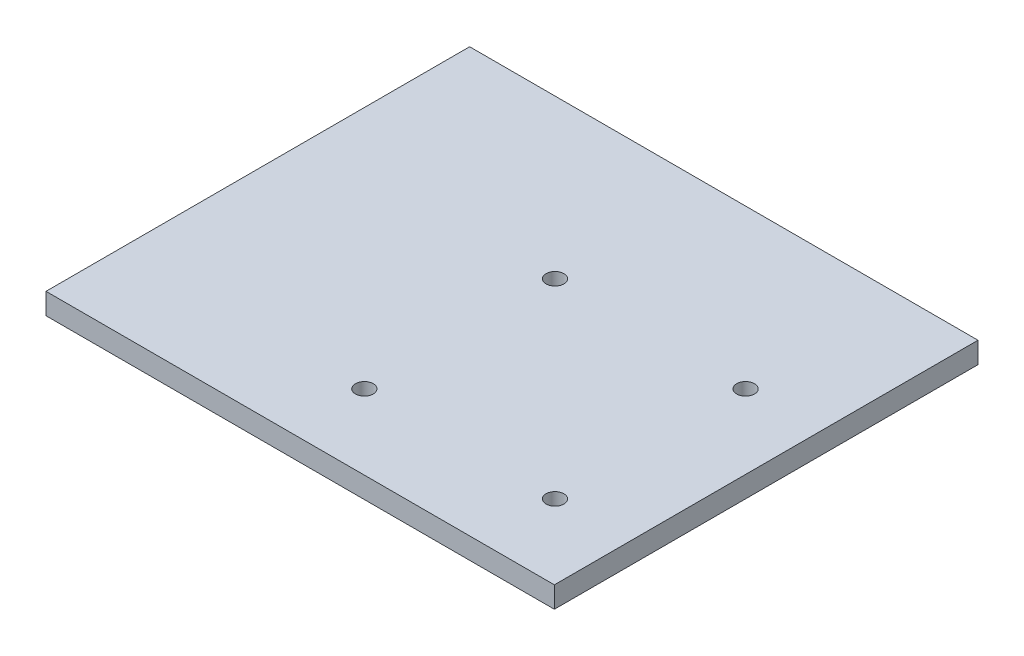
ISO-10303-21;
HEADER;
FILE_DESCRIPTION(('STEP AP214'),'2;1');
FILE_NAME('part.step','',(''),(''),'','','');
FILE_SCHEMA(('AUTOMOTIVE_DESIGN { 1 0 10303 214 1 1 1 1 }'));
ENDSEC;
DATA;
#1=APPLICATION_CONTEXT('core data for automotive mechanical design processes');
#2=APPLICATION_PROTOCOL_DEFINITION('international standard','automotive_design',2000,#1);
#3=PRODUCT_CONTEXT('',#1,'mechanical');
#4=PRODUCT('Part','Part','',(#3));
#5=PRODUCT_RELATED_PRODUCT_CATEGORY('part','',(#4));
#6=PRODUCT_DEFINITION_FORMATION('','',#4);
#7=PRODUCT_DEFINITION_CONTEXT('part definition',#1,'design');
#8=PRODUCT_DEFINITION('design','',#6,#7);
#9=PRODUCT_DEFINITION_SHAPE('','',#8);
#10=(LENGTH_UNIT() NAMED_UNIT(*) SI_UNIT(.MILLI.,.METRE.));
#11=(NAMED_UNIT(*) PLANE_ANGLE_UNIT() SI_UNIT($,.RADIAN.));
#12=(NAMED_UNIT(*) SI_UNIT($,.STERADIAN.) SOLID_ANGLE_UNIT());
#13=UNCERTAINTY_MEASURE_WITH_UNIT(LENGTH_MEASURE(1.E-05),#10,'distance_accuracy_value','');
#14=(GEOMETRIC_REPRESENTATION_CONTEXT(3) GLOBAL_UNCERTAINTY_ASSIGNED_CONTEXT((#13)) GLOBAL_UNIT_ASSIGNED_CONTEXT((#10,
#11,#12)) REPRESENTATION_CONTEXT('',''));
#15=CARTESIAN_POINT('',(0.,0.,0.));
#16=DIRECTION('',(0.,0.,1.));
#17=DIRECTION('',(1.,0.,0.));
#18=AXIS2_PLACEMENT_3D('',#15,#16,#17);
#19=CARTESIAN_POINT('',(-152.4,12.7,-127.));
#20=DIRECTION('',(1.,0.,0.));
#21=DIRECTION('',(0.,0.,-1.));
#22=AXIS2_PLACEMENT_3D('',#19,#20,#21);
#23=PLANE('',#22);
#24=DIRECTION('',(0.,0.,1.));
#25=VECTOR('',#24,1.);
#26=CARTESIAN_POINT('',(-152.4,0.,-127.));
#27=LINE('',#26,#25);
#28=CARTESIAN_POINT('',(-152.4,0.,-127.));
#29=VERTEX_POINT('',#28);
#30=CARTESIAN_POINT('',(-152.4,0.,127.));
#31=VERTEX_POINT('',#30);
#32=EDGE_CURVE('E98',#29,#31,#27,.T.);
#33=ORIENTED_EDGE('',*,*,#32,.T.);
#34=DIRECTION('',(0.,-1.,0.));
#35=VECTOR('',#34,1.);
#36=CARTESIAN_POINT('',(-152.4,12.7,127.));
#37=LINE('',#36,#35);
#38=CARTESIAN_POINT('',(-152.4,12.7,127.));
#39=VERTEX_POINT('',#38);
#40=EDGE_CURVE('E11',#39,#31,#37,.T.);
#41=ORIENTED_EDGE('',*,*,#40,.F.);
#42=DIRECTION('',(0.,0.,1.));
#43=VECTOR('',#42,1.);
#44=CARTESIAN_POINT('',(-152.4,12.7,-127.));
#45=LINE('',#44,#43);
#46=CARTESIAN_POINT('',(-152.4,12.7,-127.));
#47=VERTEX_POINT('',#46);
#48=EDGE_CURVE('E86',#47,#39,#45,.T.);
#49=ORIENTED_EDGE('',*,*,#48,.F.);
#50=DIRECTION('',(0.,-1.,0.));
#51=VECTOR('',#50,1.);
#52=CARTESIAN_POINT('',(-152.4,12.7,-127.));
#53=LINE('',#52,#51);
#54=EDGE_CURVE('E94',#47,#29,#53,.T.);
#55=ORIENTED_EDGE('',*,*,#54,.T.);
#56=EDGE_LOOP('',(#33,#41,#49,#55));
#57=FACE_BOUND('',#56,.T.);
#58=ADVANCED_FACE('F35',(#57),#23,.F.);
#59=CARTESIAN_POINT('',(-152.4,12.7,127.));
#60=DIRECTION('',(0.,0.,-1.));
#61=DIRECTION('',(-1.,0.,0.));
#62=AXIS2_PLACEMENT_3D('',#59,#60,#61);
#63=PLANE('',#62);
#64=DIRECTION('',(1.,0.,0.));
#65=VECTOR('',#64,1.);
#66=CARTESIAN_POINT('',(-152.4,0.,127.));
#67=LINE('',#66,#65);
#68=CARTESIAN_POINT('',(152.4,0.,127.));
#69=VERTEX_POINT('',#68);
#70=EDGE_CURVE('E90',#31,#69,#67,.T.);
#71=ORIENTED_EDGE('',*,*,#70,.T.);
#72=DIRECTION('',(0.,-1.,0.));
#73=VECTOR('',#72,1.);
#74=CARTESIAN_POINT('',(152.4,12.7,127.));
#75=LINE('',#74,#73);
#76=CARTESIAN_POINT('',(152.4,12.7,127.));
#77=VERTEX_POINT('',#76);
#78=EDGE_CURVE('E43',#77,#69,#75,.T.);
#79=ORIENTED_EDGE('',*,*,#78,.F.);
#80=DIRECTION('',(1.,0.,0.));
#81=VECTOR('',#80,1.);
#82=CARTESIAN_POINT('',(-152.4,12.7,127.));
#83=LINE('',#82,#81);
#84=EDGE_CURVE('E81',#39,#77,#83,.T.);
#85=ORIENTED_EDGE('',*,*,#84,.F.);
#86=ORIENTED_EDGE('',*,*,#40,.T.);
#87=EDGE_LOOP('',(#71,#79,#85,#86));
#88=FACE_BOUND('',#87,.T.);
#89=ADVANCED_FACE('F89',(#88),#63,.F.);
#90=CARTESIAN_POINT('',(152.4,12.7,-127.));
#91=DIRECTION('',(-1.,0.,0.));
#92=DIRECTION('',(0.,0.,1.));
#93=AXIS2_PLACEMENT_3D('',#90,#91,#92);
#94=PLANE('',#93);
#95=DIRECTION('',(0.,0.,-1.));
#96=VECTOR('',#95,1.);
#97=CARTESIAN_POINT('',(152.4,0.,-127.));
#98=LINE('',#97,#96);
#99=CARTESIAN_POINT('',(152.4,0.,-127.));
#100=VERTEX_POINT('',#99);
#101=EDGE_CURVE('E68',#69,#100,#98,.T.);
#102=ORIENTED_EDGE('',*,*,#101,.T.);
#103=DIRECTION('',(0.,-1.,0.));
#104=VECTOR('',#103,1.);
#105=CARTESIAN_POINT('',(152.4,12.7,-127.));
#106=LINE('',#105,#104);
#107=CARTESIAN_POINT('',(152.4,12.7,-127.));
#108=VERTEX_POINT('',#107);
#109=EDGE_CURVE('E91',#108,#100,#106,.T.);
#110=ORIENTED_EDGE('',*,*,#109,.F.);
#111=DIRECTION('',(0.,0.,-1.));
#112=VECTOR('',#111,1.);
#113=CARTESIAN_POINT('',(152.4,12.7,-127.));
#114=LINE('',#113,#112);
#115=EDGE_CURVE('E84',#77,#108,#114,.T.);
#116=ORIENTED_EDGE('',*,*,#115,.F.);
#117=ORIENTED_EDGE('',*,*,#78,.T.);
#118=EDGE_LOOP('',(#102,#110,#116,#117));
#119=FACE_BOUND('',#118,.T.);
#120=ADVANCED_FACE('F92',(#119),#94,.F.);
#121=CARTESIAN_POINT('',(-152.4,12.7,-127.));
#122=DIRECTION('',(0.,0.,1.));
#123=DIRECTION('',(1.,0.,0.));
#124=AXIS2_PLACEMENT_3D('',#121,#122,#123);
#125=PLANE('',#124);
#126=DIRECTION('',(-1.,0.,0.));
#127=VECTOR('',#126,1.);
#128=CARTESIAN_POINT('',(-152.4,0.,-127.));
#129=LINE('',#128,#127);
#130=EDGE_CURVE('E74',#100,#29,#129,.T.);
#131=ORIENTED_EDGE('',*,*,#130,.T.);
#132=ORIENTED_EDGE('',*,*,#54,.F.);
#133=DIRECTION('',(-1.,0.,0.));
#134=VECTOR('',#133,1.);
#135=CARTESIAN_POINT('',(-152.4,12.7,-127.));
#136=LINE('',#135,#134);
#137=EDGE_CURVE('E51',#108,#47,#136,.T.);
#138=ORIENTED_EDGE('',*,*,#137,.F.);
#139=ORIENTED_EDGE('',*,*,#109,.T.);
#140=EDGE_LOOP('',(#131,#132,#138,#139));
#141=FACE_BOUND('',#140,.T.);
#142=ADVANCED_FACE('F106',(#141),#125,.F.);
#143=CARTESIAN_POINT('',(0.,12.7,0.));
#144=DIRECTION('',(0.,1.,0.));
#145=DIRECTION('',(0.,0.,1.));
#146=AXIS2_PLACEMENT_3D('',#143,#144,#145);
#147=PLANE('',#146);
#148=CARTESIAN_POINT('',(-6.32516451792292,12.7,-32.0952428197147));
#149=DIRECTION('',(0.,1.,0.));
#150=DIRECTION('',(0.,0.,1.));
#151=AXIS2_PLACEMENT_3D('',#148,#149,#150);
#152=CIRCLE('',#151,5.35813);
#153=CARTESIAN_POINT('',(-6.32516451792292,12.7,-26.7371128197147));
#154=VERTEX_POINT('',#153);
#155=EDGE_CURVE('E132',#154,#154,#152,.T.);
#156=ORIENTED_EDGE('',*,*,#155,.F.);
#157=EDGE_LOOP('',(#156));
#158=FACE_BOUND('',#157,.T.);
#159=CARTESIAN_POINT('',(107.974835482077,12.7,-32.0952428197147));
#160=DIRECTION('',(0.,1.,0.));
#161=DIRECTION('',(0.,0.,1.));
#162=AXIS2_PLACEMENT_3D('',#159,#160,#161);
#163=CIRCLE('',#162,5.35813);
#164=CARTESIAN_POINT('',(107.974835482077,12.7,-26.7371128197147));
#165=VERTEX_POINT('',#164);
#166=EDGE_CURVE('E126',#165,#165,#163,.T.);
#167=ORIENTED_EDGE('',*,*,#166,.F.);
#168=EDGE_LOOP('',(#167));
#169=FACE_BOUND('',#168,.T.);
#170=CARTESIAN_POINT('',(107.974835482077,12.7,82.2047571802853));
#171=DIRECTION('',(0.,1.,0.));
#172=DIRECTION('',(0.,0.,1.));
#173=AXIS2_PLACEMENT_3D('',#170,#171,#172);
#174=CIRCLE('',#173,5.35813);
#175=CARTESIAN_POINT('',(107.974835482077,12.7,87.5628871802853));
#176=VERTEX_POINT('',#175);
#177=EDGE_CURVE('E120',#176,#176,#174,.T.);
#178=ORIENTED_EDGE('',*,*,#177,.F.);
#179=EDGE_LOOP('',(#178));
#180=FACE_BOUND('',#179,.T.);
#181=CARTESIAN_POINT('',(-6.32516451792288,12.7,82.2047571802853));
#182=DIRECTION('',(0.,1.,0.));
#183=DIRECTION('',(0.,0.,1.));
#184=AXIS2_PLACEMENT_3D('',#181,#182,#183);
#185=CIRCLE('',#184,5.35813);
#186=CARTESIAN_POINT('',(-6.32516451792288,12.7,87.5628871802853));
#187=VERTEX_POINT('',#186);
#188=EDGE_CURVE('E114',#187,#187,#185,.T.);
#189=ORIENTED_EDGE('',*,*,#188,.F.);
#190=EDGE_LOOP('',(#189));
#191=FACE_BOUND('',#190,.T.);
#192=ORIENTED_EDGE('',*,*,#48,.T.);
#193=ORIENTED_EDGE('',*,*,#84,.T.);
#194=ORIENTED_EDGE('',*,*,#115,.T.);
#195=ORIENTED_EDGE('',*,*,#137,.T.);
#196=EDGE_LOOP('',(#192,#193,#194,#195));
#197=FACE_BOUND('',#196,.T.);
#198=ADVANCED_FACE('F82',(#158,#169,#180,#191,#197),#147,.T.);
#199=CARTESIAN_POINT('',(0.,0.,0.));
#200=DIRECTION('',(0.,1.,0.));
#201=DIRECTION('',(0.,0.,1.));
#202=AXIS2_PLACEMENT_3D('',#199,#200,#201);
#203=PLANE('',#202);
#204=CARTESIAN_POINT('',(-6.32516451792292,0.,-32.0952428197147));
#205=DIRECTION('',(0.,1.,0.));
#206=DIRECTION('',(0.,0.,1.));
#207=AXIS2_PLACEMENT_3D('',#204,#205,#206);
#208=CIRCLE('',#207,5.35813);
#209=CARTESIAN_POINT('',(-6.32516451792292,0.,-26.7371128197147));
#210=VERTEX_POINT('',#209);
#211=EDGE_CURVE('E129',#210,#210,#208,.T.);
#212=ORIENTED_EDGE('',*,*,#211,.T.);
#213=EDGE_LOOP('',(#212));
#214=FACE_BOUND('',#213,.T.);
#215=CARTESIAN_POINT('',(107.974835482077,0.,-32.0952428197147));
#216=DIRECTION('',(0.,1.,0.));
#217=DIRECTION('',(0.,0.,1.));
#218=AXIS2_PLACEMENT_3D('',#215,#216,#217);
#219=CIRCLE('',#218,5.35813);
#220=CARTESIAN_POINT('',(107.974835482077,0.,-26.7371128197147));
#221=VERTEX_POINT('',#220);
#222=EDGE_CURVE('E123',#221,#221,#219,.T.);
#223=ORIENTED_EDGE('',*,*,#222,.T.);
#224=EDGE_LOOP('',(#223));
#225=FACE_BOUND('',#224,.T.);
#226=CARTESIAN_POINT('',(107.974835482077,0.,82.2047571802853));
#227=DIRECTION('',(0.,1.,0.));
#228=DIRECTION('',(0.,0.,1.));
#229=AXIS2_PLACEMENT_3D('',#226,#227,#228);
#230=CIRCLE('',#229,5.35813);
#231=CARTESIAN_POINT('',(107.974835482077,0.,87.5628871802853));
#232=VERTEX_POINT('',#231);
#233=EDGE_CURVE('E117',#232,#232,#230,.T.);
#234=ORIENTED_EDGE('',*,*,#233,.T.);
#235=EDGE_LOOP('',(#234));
#236=FACE_BOUND('',#235,.T.);
#237=CARTESIAN_POINT('',(-6.32516451792288,0.,82.2047571802853));
#238=DIRECTION('',(0.,1.,0.));
#239=DIRECTION('',(0.,0.,1.));
#240=AXIS2_PLACEMENT_3D('',#237,#238,#239);
#241=CIRCLE('',#240,5.35813);
#242=CARTESIAN_POINT('',(-6.32516451792288,0.,87.5628871802853));
#243=VERTEX_POINT('',#242);
#244=EDGE_CURVE('E101',#243,#243,#241,.T.);
#245=ORIENTED_EDGE('',*,*,#244,.T.);
#246=EDGE_LOOP('',(#245));
#247=FACE_BOUND('',#246,.T.);
#248=ORIENTED_EDGE('',*,*,#32,.F.);
#249=ORIENTED_EDGE('',*,*,#130,.F.);
#250=ORIENTED_EDGE('',*,*,#101,.F.);
#251=ORIENTED_EDGE('',*,*,#70,.F.);
#252=EDGE_LOOP('',(#248,#249,#250,#251));
#253=FACE_BOUND('',#252,.T.);
#254=ADVANCED_FACE('F109',(#214,#225,#236,#247,#253),#203,.F.);
#255=CARTESIAN_POINT('',(-6.32516451792288,12.7,82.2047571802853));
#256=DIRECTION('',(0.,1.,0.));
#257=DIRECTION('',(0.,0.,1.));
#258=AXIS2_PLACEMENT_3D('',#255,#256,#257);
#259=CYLINDRICAL_SURFACE('',#258,5.35813);
#260=ORIENTED_EDGE('',*,*,#244,.F.);
#261=EDGE_LOOP('',(#260));
#262=FACE_BOUND('',#261,.T.);
#263=ORIENTED_EDGE('',*,*,#188,.T.);
#264=EDGE_LOOP('',(#263));
#265=FACE_BOUND('',#264,.T.);
#266=ADVANCED_FACE('F147',(#262,#265),#259,.F.);
#267=CARTESIAN_POINT('',(107.974835482077,12.7,82.2047571802853));
#268=DIRECTION('',(0.,1.,0.));
#269=DIRECTION('',(0.,0.,1.));
#270=AXIS2_PLACEMENT_3D('',#267,#268,#269);
#271=CYLINDRICAL_SURFACE('',#270,5.35813);
#272=ORIENTED_EDGE('',*,*,#233,.F.);
#273=EDGE_LOOP('',(#272));
#274=FACE_BOUND('',#273,.T.);
#275=ORIENTED_EDGE('',*,*,#177,.T.);
#276=EDGE_LOOP('',(#275));
#277=FACE_BOUND('',#276,.T.);
#278=ADVANCED_FACE('F149',(#274,#277),#271,.F.);
#279=CARTESIAN_POINT('',(107.974835482077,12.7,-32.0952428197147));
#280=DIRECTION('',(0.,1.,0.));
#281=DIRECTION('',(0.,0.,1.));
#282=AXIS2_PLACEMENT_3D('',#279,#280,#281);
#283=CYLINDRICAL_SURFACE('',#282,5.35813);
#284=ORIENTED_EDGE('',*,*,#222,.F.);
#285=EDGE_LOOP('',(#284));
#286=FACE_BOUND('',#285,.T.);
#287=ORIENTED_EDGE('',*,*,#166,.T.);
#288=EDGE_LOOP('',(#287));
#289=FACE_BOUND('',#288,.T.);
#290=ADVANCED_FACE('F156',(#286,#289),#283,.F.);
#291=CARTESIAN_POINT('',(-6.32516451792292,12.7,-32.0952428197147));
#292=DIRECTION('',(0.,1.,0.));
#293=DIRECTION('',(0.,0.,1.));
#294=AXIS2_PLACEMENT_3D('',#291,#292,#293);
#295=CYLINDRICAL_SURFACE('',#294,5.35813);
#296=ORIENTED_EDGE('',*,*,#211,.F.);
#297=EDGE_LOOP('',(#296));
#298=FACE_BOUND('',#297,.T.);
#299=ORIENTED_EDGE('',*,*,#155,.T.);
#300=EDGE_LOOP('',(#299));
#301=FACE_BOUND('',#300,.T.);
#302=ADVANCED_FACE('F136',(#298,#301),#295,.F.);
#303=CLOSED_SHELL('',(#58,#89,#120,#142,#198,#254,#266,#278,#290,#302));
#304=MANIFOLD_SOLID_BREP('B2',#303);
#305=ADVANCED_BREP_SHAPE_REPRESENTATION('',(#18,#304),#14);
#306=SHAPE_DEFINITION_REPRESENTATION(#9,#305);
ENDSEC;
END-ISO-10303-21;
